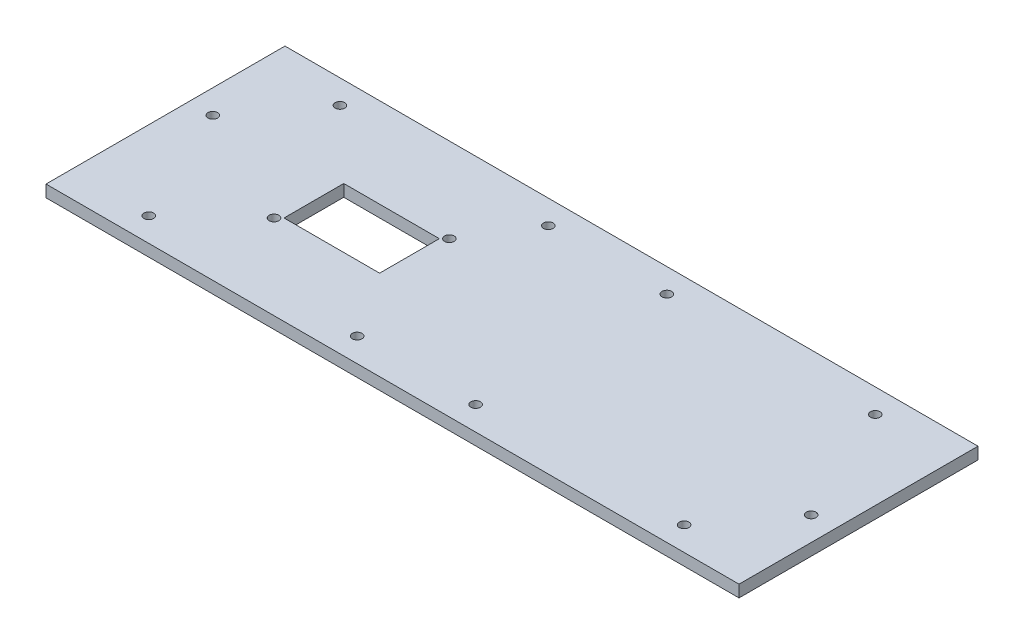
ISO-10303-21;
HEADER;
FILE_DESCRIPTION(('STEP AP214'),'2;1');
FILE_NAME('part.step','',(''),(''),'','','');
FILE_SCHEMA(('AUTOMOTIVE_DESIGN { 1 0 10303 214 1 1 1 1 }'));
ENDSEC;
DATA;
#1=APPLICATION_CONTEXT('core data for automotive mechanical design processes');
#2=APPLICATION_PROTOCOL_DEFINITION('international standard','automotive_design',2000,#1);
#3=PRODUCT_CONTEXT('',#1,'mechanical');
#4=PRODUCT('Part','Part','',(#3));
#5=PRODUCT_RELATED_PRODUCT_CATEGORY('part','',(#4));
#6=PRODUCT_DEFINITION_FORMATION('','',#4);
#7=PRODUCT_DEFINITION_CONTEXT('part definition',#1,'design');
#8=PRODUCT_DEFINITION('design','',#6,#7);
#9=PRODUCT_DEFINITION_SHAPE('','',#8);
#10=(LENGTH_UNIT() NAMED_UNIT(*) SI_UNIT(.MILLI.,.METRE.));
#11=(NAMED_UNIT(*) PLANE_ANGLE_UNIT() SI_UNIT($,.RADIAN.));
#12=(NAMED_UNIT(*) SI_UNIT($,.STERADIAN.) SOLID_ANGLE_UNIT());
#13=UNCERTAINTY_MEASURE_WITH_UNIT(LENGTH_MEASURE(1.E-05),#10,'distance_accuracy_value','');
#14=(GEOMETRIC_REPRESENTATION_CONTEXT(3) GLOBAL_UNCERTAINTY_ASSIGNED_CONTEXT((#13)) GLOBAL_UNIT_ASSIGNED_CONTEXT((#10,
#11,#12)) REPRESENTATION_CONTEXT('',''));
#15=CARTESIAN_POINT('',(0.,0.,0.));
#16=DIRECTION('',(0.,0.,1.));
#17=DIRECTION('',(1.,0.,0.));
#18=AXIS2_PLACEMENT_3D('',#15,#16,#17);
#19=CARTESIAN_POINT('',(0.,6.35,0.));
#20=DIRECTION('',(0.,-1.,0.));
#21=DIRECTION('',(0.,0.,-1.));
#22=AXIS2_PLACEMENT_3D('',#19,#20,#21);
#23=PLANE('',#22);
#24=DIRECTION('',(1.,0.,0.));
#25=VECTOR('',#24,1.);
#26=CARTESIAN_POINT('',(129.667,6.35,-47.6250000000013));
#27=LINE('',#26,#25);
#28=CARTESIAN_POINT('',(78.867,6.35,-47.6250000000013));
#29=VERTEX_POINT('',#28);
#30=CARTESIAN_POINT('',(129.667,6.35,-47.6250000000013));
#31=VERTEX_POINT('',#30);
#32=EDGE_CURVE('E117',#29,#31,#27,.T.);
#33=ORIENTED_EDGE('',*,*,#32,.F.);
#34=DIRECTION('',(0.,0.,1.));
#35=VECTOR('',#34,1.);
#36=CARTESIAN_POINT('',(78.867,6.35,-79.3750000000013));
#37=LINE('',#36,#35);
#38=CARTESIAN_POINT('',(78.867,6.35,-79.3750000000013));
#39=VERTEX_POINT('',#38);
#40=EDGE_CURVE('E100',#39,#29,#37,.T.);
#41=ORIENTED_EDGE('',*,*,#40,.F.);
#42=DIRECTION('',(-1.,0.,0.));
#43=VECTOR('',#42,1.);
#44=CARTESIAN_POINT('',(129.667,6.35,-79.3750000000013));
#45=LINE('',#44,#43);
#46=CARTESIAN_POINT('',(129.667,6.35,-79.3750000000013));
#47=VERTEX_POINT('',#46);
#48=EDGE_CURVE('E109',#47,#39,#45,.T.);
#49=ORIENTED_EDGE('',*,*,#48,.F.);
#50=DIRECTION('',(0.,0.,-1.));
#51=VECTOR('',#50,1.);
#52=CARTESIAN_POINT('',(129.667,6.35,-79.3750000000013));
#53=LINE('',#52,#51);
#54=EDGE_CURVE('E48',#31,#47,#53,.T.);
#55=ORIENTED_EDGE('',*,*,#54,.F.);
#56=EDGE_LOOP('',(#33,#41,#49,#55));
#57=FACE_BOUND('',#56,.T.);
#58=CARTESIAN_POINT('',(132.334,6.35,-82.0420000000013));
#59=DIRECTION('',(0.,-1.,0.));
#60=DIRECTION('',(0.,0.,-1.));
#61=AXIS2_PLACEMENT_3D('',#58,#59,#60);
#62=CIRCLE('',#61,2.55269999999998);
#63=CARTESIAN_POINT('',(132.334,6.35,-84.5947000000012));
#64=VERTEX_POINT('',#63);
#65=EDGE_CURVE('E136',#64,#64,#62,.F.);
#66=ORIENTED_EDGE('',*,*,#65,.F.);
#67=EDGE_LOOP('',(#66));
#68=FACE_BOUND('',#67,.T.);
#69=CARTESIAN_POINT('',(76.2,6.35,-44.9580000000013));
#70=DIRECTION('',(0.,-1.,0.));
#71=DIRECTION('',(0.,0.,-1.));
#72=AXIS2_PLACEMENT_3D('',#69,#70,#71);
#73=CIRCLE('',#72,2.55270000000001);
#74=CARTESIAN_POINT('',(76.2,6.35,-47.5107000000013));
#75=VERTEX_POINT('',#74);
#76=EDGE_CURVE('E142',#75,#75,#73,.F.);
#77=ORIENTED_EDGE('',*,*,#76,.F.);
#78=EDGE_LOOP('',(#77));
#79=FACE_BOUND('',#78,.T.);
#80=DIRECTION('',(0.,0.,-1.));
#81=VECTOR('',#80,1.);
#82=CARTESIAN_POINT('',(368.3,6.35,-127.000000000001));
#83=LINE('',#82,#81);
#84=CARTESIAN_POINT('',(368.3,6.35,-1.27675647831893E-12));
#85=VERTEX_POINT('',#84);
#86=CARTESIAN_POINT('',(368.3,6.35,-127.000000000001));
#87=VERTEX_POINT('',#86);
#88=EDGE_CURVE('E206',#85,#87,#83,.T.);
#89=ORIENTED_EDGE('',*,*,#88,.T.);
#90=DIRECTION('',(-1.,0.,0.));
#91=VECTOR('',#90,1.);
#92=CARTESIAN_POINT('',(368.3,6.35,-127.000000000001));
#93=LINE('',#92,#91);
#94=CARTESIAN_POINT('',(-4.44089209850054E-13,6.35,-127.000000000001));
#95=VERTEX_POINT('',#94);
#96=EDGE_CURVE('E209',#87,#95,#93,.T.);
#97=ORIENTED_EDGE('',*,*,#96,.T.);
#98=DIRECTION('',(0.,0.,1.));
#99=VECTOR('',#98,1.);
#100=CARTESIAN_POINT('',(-4.44089209850054E-13,6.35,-127.000000000001));
#101=LINE('',#100,#99);
#102=CARTESIAN_POINT('',(4.44089209850063E-13,6.35,1.30451205393456E-12));
#103=VERTEX_POINT('',#102);
#104=EDGE_CURVE('E212',#95,#103,#101,.T.);
#105=ORIENTED_EDGE('',*,*,#104,.T.);
#106=DIRECTION('',(1.,0.,0.));
#107=VECTOR('',#106,1.);
#108=CARTESIAN_POINT('',(368.3,6.35,-1.27675647831893E-12));
#109=LINE('',#108,#107);
#110=EDGE_CURVE('E214',#103,#85,#109,.T.);
#111=ORIENTED_EDGE('',*,*,#110,.T.);
#112=EDGE_LOOP('',(#89,#97,#105,#111));
#113=FACE_BOUND('',#112,.T.);
#114=CARTESIAN_POINT('',(326.39,6.35,-12.700000000001));
#115=DIRECTION('',(0.,1.,0.));
#116=DIRECTION('',(0.,0.,1.));
#117=AXIS2_PLACEMENT_3D('',#114,#115,#116);
#118=CIRCLE('',#117,2.5527);
#119=CARTESIAN_POINT('',(326.39,6.35,-10.147300000001));
#120=VERTEX_POINT('',#119);
#121=EDGE_CURVE('E200',#120,#120,#118,.T.);
#122=ORIENTED_EDGE('',*,*,#121,.F.);
#123=EDGE_LOOP('',(#122));
#124=FACE_BOUND('',#123,.T.);
#125=CARTESIAN_POINT('',(41.9100000000004,6.35,-12.699999999999));
#126=DIRECTION('',(0.,1.,0.));
#127=DIRECTION('',(0.,0.,1.));
#128=AXIS2_PLACEMENT_3D('',#125,#126,#127);
#129=CIRCLE('',#128,2.5527);
#130=CARTESIAN_POINT('',(41.9100000000004,6.35,-10.147299999999));
#131=VERTEX_POINT('',#130);
#132=EDGE_CURVE('E194',#131,#131,#129,.T.);
#133=ORIENTED_EDGE('',*,*,#132,.F.);
#134=EDGE_LOOP('',(#133));
#135=FACE_BOUND('',#134,.T.);
#136=CARTESIAN_POINT('',(215.646,6.35,-12.7000000000002));
#137=DIRECTION('',(0.,1.,0.));
#138=DIRECTION('',(0.,0.,1.));
#139=AXIS2_PLACEMENT_3D('',#136,#137,#138);
#140=CIRCLE('',#139,2.55270000000002);
#141=CARTESIAN_POINT('',(215.646,6.35,-10.1473000000002));
#142=VERTEX_POINT('',#141);
#143=EDGE_CURVE('E188',#142,#142,#140,.T.);
#144=ORIENTED_EDGE('',*,*,#143,.F.);
#145=EDGE_LOOP('',(#144));
#146=FACE_BOUND('',#145,.T.);
#147=CARTESIAN_POINT('',(152.654,6.35,-12.6999999999998));
#148=DIRECTION('',(0.,1.,0.));
#149=DIRECTION('',(0.,0.,1.));
#150=AXIS2_PLACEMENT_3D('',#147,#148,#149);
#151=CIRCLE('',#150,2.55270000000005);
#152=CARTESIAN_POINT('',(152.654,6.35,-10.1472999999997));
#153=VERTEX_POINT('',#152);
#154=EDGE_CURVE('E182',#153,#153,#151,.T.);
#155=ORIENTED_EDGE('',*,*,#154,.F.);
#156=EDGE_LOOP('',(#155));
#157=FACE_BOUND('',#156,.T.);
#158=CARTESIAN_POINT('',(215.646,6.35,-114.300000000001));
#159=DIRECTION('',(0.,1.,0.));
#160=DIRECTION('',(0.,0.,1.));
#161=AXIS2_PLACEMENT_3D('',#158,#159,#160);
#162=CIRCLE('',#161,2.55270000000075);
#163=CARTESIAN_POINT('',(215.646,6.35,-111.747300000001));
#164=VERTEX_POINT('',#163);
#165=EDGE_CURVE('E176',#164,#164,#162,.T.);
#166=ORIENTED_EDGE('',*,*,#165,.F.);
#167=EDGE_LOOP('',(#166));
#168=FACE_BOUND('',#167,.T.);
#169=CARTESIAN_POINT('',(41.9099999999996,6.35,-114.3));
#170=DIRECTION('',(0.,1.,0.));
#171=DIRECTION('',(0.,0.,1.));
#172=AXIS2_PLACEMENT_3D('',#169,#170,#171);
#173=CIRCLE('',#172,2.5527000000003);
#174=CARTESIAN_POINT('',(41.9099999999996,6.35,-111.7473));
#175=VERTEX_POINT('',#174);
#176=EDGE_CURVE('E170',#175,#175,#173,.T.);
#177=ORIENTED_EDGE('',*,*,#176,.F.);
#178=EDGE_LOOP('',(#177));
#179=FACE_BOUND('',#178,.T.);
#180=CARTESIAN_POINT('',(326.39,6.35,-114.300000000002));
#181=DIRECTION('',(0.,1.,0.));
#182=DIRECTION('',(0.,0.,1.));
#183=AXIS2_PLACEMENT_3D('',#180,#181,#182);
#184=CIRCLE('',#183,2.55270000000072);
#185=CARTESIAN_POINT('',(326.39,6.35,-111.747300000002));
#186=VERTEX_POINT('',#185);
#187=EDGE_CURVE('E164',#186,#186,#184,.T.);
#188=ORIENTED_EDGE('',*,*,#187,.F.);
#189=EDGE_LOOP('',(#188));
#190=FACE_BOUND('',#189,.T.);
#191=CARTESIAN_POINT('',(152.654,6.35,-114.300000000001));
#192=DIRECTION('',(0.,1.,0.));
#193=DIRECTION('',(0.,0.,1.));
#194=AXIS2_PLACEMENT_3D('',#191,#192,#193);
#195=CIRCLE('',#194,2.5527000000004);
#196=CARTESIAN_POINT('',(152.654,6.35,-111.747300000001));
#197=VERTEX_POINT('',#196);
#198=EDGE_CURVE('E158',#197,#197,#195,.T.);
#199=ORIENTED_EDGE('',*,*,#198,.F.);
#200=EDGE_LOOP('',(#199));
#201=FACE_BOUND('',#200,.T.);
#202=CARTESIAN_POINT('',(12.7000000000001,6.35,-75.9460000000007));
#203=DIRECTION('',(0.,1.,0.));
#204=DIRECTION('',(0.,0.,1.));
#205=AXIS2_PLACEMENT_3D('',#202,#203,#204);
#206=CIRCLE('',#205,2.55270000000064);
#207=CARTESIAN_POINT('',(12.7000000000001,6.35,-73.3933));
#208=VERTEX_POINT('',#207);
#209=EDGE_CURVE('E152',#208,#208,#206,.T.);
#210=ORIENTED_EDGE('',*,*,#209,.F.);
#211=EDGE_LOOP('',(#210));
#212=FACE_BOUND('',#211,.T.);
#213=CARTESIAN_POINT('',(355.6,6.35,-51.0540000000012));
#214=DIRECTION('',(0.,1.,0.));
#215=DIRECTION('',(0.,0.,1.));
#216=AXIS2_PLACEMENT_3D('',#213,#214,#215);
#217=CIRCLE('',#216,2.55270000000021);
#218=CARTESIAN_POINT('',(355.6,6.35,-48.501300000001));
#219=VERTEX_POINT('',#218);
#220=EDGE_CURVE('E146',#219,#219,#217,.T.);
#221=ORIENTED_EDGE('',*,*,#220,.F.);
#222=EDGE_LOOP('',(#221));
#223=FACE_BOUND('',#222,.T.);
#224=ADVANCED_FACE('F33',(#57,#68,#79,#113,#124,#135,#146,#157,#168,#179,#190,#201,#212,#223),
#23,.F.);
#225=CARTESIAN_POINT('',(0.,0.,0.));
#226=DIRECTION('',(0.,-1.,0.));
#227=DIRECTION('',(0.,0.,-1.));
#228=AXIS2_PLACEMENT_3D('',#225,#226,#227);
#229=PLANE('',#228);
#230=DIRECTION('',(0.,0.,-1.));
#231=VECTOR('',#230,1.);
#232=CARTESIAN_POINT('',(78.867,0.,-79.3750000000013));
#233=LINE('',#232,#231);
#234=CARTESIAN_POINT('',(78.867,0.,-47.6250000000013));
#235=VERTEX_POINT('',#234);
#236=CARTESIAN_POINT('',(78.867,0.,-79.3750000000013));
#237=VERTEX_POINT('',#236);
#238=EDGE_CURVE('E56',#235,#237,#233,.T.);
#239=ORIENTED_EDGE('',*,*,#238,.F.);
#240=DIRECTION('',(-1.,0.,0.));
#241=VECTOR('',#240,1.);
#242=CARTESIAN_POINT('',(129.667,0.,-47.6250000000013));
#243=LINE('',#242,#241);
#244=CARTESIAN_POINT('',(129.667,0.,-47.6250000000013));
#245=VERTEX_POINT('',#244);
#246=EDGE_CURVE('E106',#245,#235,#243,.T.);
#247=ORIENTED_EDGE('',*,*,#246,.F.);
#248=DIRECTION('',(0.,0.,1.));
#249=VECTOR('',#248,1.);
#250=CARTESIAN_POINT('',(129.667,0.,-79.3750000000013));
#251=LINE('',#250,#249);
#252=CARTESIAN_POINT('',(129.667,0.,-79.3750000000013));
#253=VERTEX_POINT('',#252);
#254=EDGE_CURVE('E125',#253,#245,#251,.T.);
#255=ORIENTED_EDGE('',*,*,#254,.F.);
#256=DIRECTION('',(1.,0.,0.));
#257=VECTOR('',#256,1.);
#258=CARTESIAN_POINT('',(129.667,0.,-79.3750000000013));
#259=LINE('',#258,#257);
#260=EDGE_CURVE('E119',#237,#253,#259,.T.);
#261=ORIENTED_EDGE('',*,*,#260,.F.);
#262=EDGE_LOOP('',(#239,#247,#255,#261));
#263=FACE_BOUND('',#262,.T.);
#264=CARTESIAN_POINT('',(132.334,0.,-82.0420000000013));
#265=DIRECTION('',(0.,-1.,0.));
#266=DIRECTION('',(0.,0.,-1.));
#267=AXIS2_PLACEMENT_3D('',#264,#265,#266);
#268=CIRCLE('',#267,2.55269999999998);
#269=CARTESIAN_POINT('',(132.334,0.,-84.5947000000012));
#270=VERTEX_POINT('',#269);
#271=EDGE_CURVE('E112',#270,#270,#268,.T.);
#272=ORIENTED_EDGE('',*,*,#271,.F.);
#273=EDGE_LOOP('',(#272));
#274=FACE_BOUND('',#273,.T.);
#275=CARTESIAN_POINT('',(76.2,0.,-44.9580000000013));
#276=DIRECTION('',(0.,-1.,0.));
#277=DIRECTION('',(0.,0.,-1.));
#278=AXIS2_PLACEMENT_3D('',#275,#276,#277);
#279=CIRCLE('',#278,2.55270000000001);
#280=CARTESIAN_POINT('',(76.2,0.,-47.5107000000013));
#281=VERTEX_POINT('',#280);
#282=EDGE_CURVE('E139',#281,#281,#279,.T.);
#283=ORIENTED_EDGE('',*,*,#282,.F.);
#284=EDGE_LOOP('',(#283));
#285=FACE_BOUND('',#284,.T.);
#286=CARTESIAN_POINT('',(12.7000000000001,0.,-75.9460000000007));
#287=DIRECTION('',(0.,1.,0.));
#288=DIRECTION('',(0.,0.,1.));
#289=AXIS2_PLACEMENT_3D('',#286,#287,#288);
#290=CIRCLE('',#289,2.55270000000064);
#291=CARTESIAN_POINT('',(12.7000000000001,0.,-73.3933));
#292=VERTEX_POINT('',#291);
#293=EDGE_CURVE('E149',#292,#292,#290,.T.);
#294=ORIENTED_EDGE('',*,*,#293,.T.);
#295=EDGE_LOOP('',(#294));
#296=FACE_BOUND('',#295,.T.);
#297=CARTESIAN_POINT('',(326.39,0.,-114.300000000002));
#298=DIRECTION('',(0.,1.,0.));
#299=DIRECTION('',(0.,0.,1.));
#300=AXIS2_PLACEMENT_3D('',#297,#298,#299);
#301=CIRCLE('',#300,2.55270000000072);
#302=CARTESIAN_POINT('',(326.39,0.,-111.747300000002));
#303=VERTEX_POINT('',#302);
#304=EDGE_CURVE('E161',#303,#303,#301,.T.);
#305=ORIENTED_EDGE('',*,*,#304,.T.);
#306=EDGE_LOOP('',(#305));
#307=FACE_BOUND('',#306,.T.);
#308=CARTESIAN_POINT('',(215.646,0.,-114.300000000001));
#309=DIRECTION('',(0.,1.,0.));
#310=DIRECTION('',(0.,0.,1.));
#311=AXIS2_PLACEMENT_3D('',#308,#309,#310);
#312=CIRCLE('',#311,2.55270000000075);
#313=CARTESIAN_POINT('',(215.646,0.,-111.747300000001));
#314=VERTEX_POINT('',#313);
#315=EDGE_CURVE('E173',#314,#314,#312,.T.);
#316=ORIENTED_EDGE('',*,*,#315,.T.);
#317=EDGE_LOOP('',(#316));
#318=FACE_BOUND('',#317,.T.);
#319=CARTESIAN_POINT('',(215.646,0.,-12.7000000000002));
#320=DIRECTION('',(0.,1.,0.));
#321=DIRECTION('',(0.,0.,1.));
#322=AXIS2_PLACEMENT_3D('',#319,#320,#321);
#323=CIRCLE('',#322,2.55270000000002);
#324=CARTESIAN_POINT('',(215.646,0.,-10.1473000000002));
#325=VERTEX_POINT('',#324);
#326=EDGE_CURVE('E185',#325,#325,#323,.T.);
#327=ORIENTED_EDGE('',*,*,#326,.T.);
#328=EDGE_LOOP('',(#327));
#329=FACE_BOUND('',#328,.T.);
#330=CARTESIAN_POINT('',(326.39,0.,-12.700000000001));
#331=DIRECTION('',(0.,1.,0.));
#332=DIRECTION('',(0.,0.,1.));
#333=AXIS2_PLACEMENT_3D('',#330,#331,#332);
#334=CIRCLE('',#333,2.5527);
#335=CARTESIAN_POINT('',(326.39,0.,-10.147300000001));
#336=VERTEX_POINT('',#335);
#337=EDGE_CURVE('E197',#336,#336,#334,.T.);
#338=ORIENTED_EDGE('',*,*,#337,.T.);
#339=EDGE_LOOP('',(#338));
#340=FACE_BOUND('',#339,.T.);
#341=DIRECTION('',(0.,0.,-1.));
#342=VECTOR('',#341,1.);
#343=CARTESIAN_POINT('',(368.3,0.,-127.000000000001));
#344=LINE('',#343,#342);
#345=CARTESIAN_POINT('',(368.3,0.,-1.27675647831893E-12));
#346=VERTEX_POINT('',#345);
#347=CARTESIAN_POINT('',(368.3,0.,-127.000000000001));
#348=VERTEX_POINT('',#347);
#349=EDGE_CURVE('E203',#346,#348,#344,.T.);
#350=ORIENTED_EDGE('',*,*,#349,.F.);
#351=DIRECTION('',(1.,0.,0.));
#352=VECTOR('',#351,1.);
#353=CARTESIAN_POINT('',(368.3,0.,-1.27675647831893E-12));
#354=LINE('',#353,#352);
#355=CARTESIAN_POINT('',(4.44089209850063E-13,0.,1.30451205393456E-12));
#356=VERTEX_POINT('',#355);
#357=EDGE_CURVE('E210',#356,#346,#354,.T.);
#358=ORIENTED_EDGE('',*,*,#357,.F.);
#359=DIRECTION('',(0.,0.,1.));
#360=VECTOR('',#359,1.);
#361=CARTESIAN_POINT('',(-4.44089209850054E-13,0.,-127.000000000001));
#362=LINE('',#361,#360);
#363=CARTESIAN_POINT('',(-4.44089209850054E-13,0.,-127.000000000001));
#364=VERTEX_POINT('',#363);
#365=EDGE_CURVE('E221',#364,#356,#362,.T.);
#366=ORIENTED_EDGE('',*,*,#365,.F.);
#367=DIRECTION('',(-1.,0.,0.));
#368=VECTOR('',#367,1.);
#369=CARTESIAN_POINT('',(368.3,0.,-127.000000000001));
#370=LINE('',#369,#368);
#371=EDGE_CURVE('E219',#348,#364,#370,.T.);
#372=ORIENTED_EDGE('',*,*,#371,.F.);
#373=EDGE_LOOP('',(#350,#358,#366,#372));
#374=FACE_BOUND('',#373,.T.);
#375=CARTESIAN_POINT('',(41.9100000000004,0.,-12.699999999999));
#376=DIRECTION('',(0.,1.,0.));
#377=DIRECTION('',(0.,0.,1.));
#378=AXIS2_PLACEMENT_3D('',#375,#376,#377);
#379=CIRCLE('',#378,2.5527);
#380=CARTESIAN_POINT('',(41.9100000000004,0.,-10.147299999999));
#381=VERTEX_POINT('',#380);
#382=EDGE_CURVE('E191',#381,#381,#379,.T.);
#383=ORIENTED_EDGE('',*,*,#382,.T.);
#384=EDGE_LOOP('',(#383));
#385=FACE_BOUND('',#384,.T.);
#386=CARTESIAN_POINT('',(152.654,0.,-12.6999999999998));
#387=DIRECTION('',(0.,1.,0.));
#388=DIRECTION('',(0.,0.,1.));
#389=AXIS2_PLACEMENT_3D('',#386,#387,#388);
#390=CIRCLE('',#389,2.55270000000005);
#391=CARTESIAN_POINT('',(152.654,0.,-10.1472999999997));
#392=VERTEX_POINT('',#391);
#393=EDGE_CURVE('E179',#392,#392,#390,.T.);
#394=ORIENTED_EDGE('',*,*,#393,.T.);
#395=EDGE_LOOP('',(#394));
#396=FACE_BOUND('',#395,.T.);
#397=CARTESIAN_POINT('',(41.9099999999996,0.,-114.3));
#398=DIRECTION('',(0.,1.,0.));
#399=DIRECTION('',(0.,0.,1.));
#400=AXIS2_PLACEMENT_3D('',#397,#398,#399);
#401=CIRCLE('',#400,2.5527000000003);
#402=CARTESIAN_POINT('',(41.9099999999996,0.,-111.7473));
#403=VERTEX_POINT('',#402);
#404=EDGE_CURVE('E167',#403,#403,#401,.T.);
#405=ORIENTED_EDGE('',*,*,#404,.T.);
#406=EDGE_LOOP('',(#405));
#407=FACE_BOUND('',#406,.T.);
#408=CARTESIAN_POINT('',(152.654,0.,-114.300000000001));
#409=DIRECTION('',(0.,1.,0.));
#410=DIRECTION('',(0.,0.,1.));
#411=AXIS2_PLACEMENT_3D('',#408,#409,#410);
#412=CIRCLE('',#411,2.5527000000004);
#413=CARTESIAN_POINT('',(152.654,0.,-111.747300000001));
#414=VERTEX_POINT('',#413);
#415=EDGE_CURVE('E155',#414,#414,#412,.T.);
#416=ORIENTED_EDGE('',*,*,#415,.T.);
#417=EDGE_LOOP('',(#416));
#418=FACE_BOUND('',#417,.T.);
#419=CARTESIAN_POINT('',(355.6,0.,-51.0540000000012));
#420=DIRECTION('',(0.,1.,0.));
#421=DIRECTION('',(0.,0.,1.));
#422=AXIS2_PLACEMENT_3D('',#419,#420,#421);
#423=CIRCLE('',#422,2.55270000000021);
#424=CARTESIAN_POINT('',(355.6,0.,-48.501300000001));
#425=VERTEX_POINT('',#424);
#426=EDGE_CURVE('E145',#425,#425,#423,.T.);
#427=ORIENTED_EDGE('',*,*,#426,.T.);
#428=EDGE_LOOP('',(#427));
#429=FACE_BOUND('',#428,.T.);
#430=ADVANCED_FACE('F239',(#263,#274,#285,#296,#307,#318,#329,#340,#374,#385,#396,#407,#418,
#429),#229,.T.);
#431=CARTESIAN_POINT('',(368.3,6.35,-127.000000000001));
#432=DIRECTION('',(-1.,0.,0.));
#433=DIRECTION('',(0.,0.,1.));
#434=AXIS2_PLACEMENT_3D('',#431,#432,#433);
#435=PLANE('',#434);
#436=ORIENTED_EDGE('',*,*,#349,.T.);
#437=DIRECTION('',(0.,-1.,0.));
#438=VECTOR('',#437,1.);
#439=CARTESIAN_POINT('',(368.3,6.35,-127.000000000001));
#440=LINE('',#439,#438);
#441=EDGE_CURVE('E11',#87,#348,#440,.T.);
#442=ORIENTED_EDGE('',*,*,#441,.F.);
#443=ORIENTED_EDGE('',*,*,#88,.F.);
#444=DIRECTION('',(0.,-1.,0.));
#445=VECTOR('',#444,1.);
#446=CARTESIAN_POINT('',(368.3,6.35,-1.27675647831893E-12));
#447=LINE('',#446,#445);
#448=EDGE_CURVE('E216',#85,#346,#447,.T.);
#449=ORIENTED_EDGE('',*,*,#448,.T.);
#450=EDGE_LOOP('',(#436,#442,#443,#449));
#451=FACE_BOUND('',#450,.T.);
#452=ADVANCED_FACE('F35',(#451),#435,.F.);
#453=CARTESIAN_POINT('',(368.3,6.35,-127.000000000001));
#454=DIRECTION('',(0.,0.,1.));
#455=DIRECTION('',(1.,0.,0.));
#456=AXIS2_PLACEMENT_3D('',#453,#454,#455);
#457=PLANE('',#456);
#458=ORIENTED_EDGE('',*,*,#371,.T.);
#459=DIRECTION('',(0.,-1.,0.));
#460=VECTOR('',#459,1.);
#461=CARTESIAN_POINT('',(-4.44089209850054E-13,6.35,-127.000000000001));
#462=LINE('',#461,#460);
#463=EDGE_CURVE('E41',#95,#364,#462,.T.);
#464=ORIENTED_EDGE('',*,*,#463,.F.);
#465=ORIENTED_EDGE('',*,*,#96,.F.);
#466=ORIENTED_EDGE('',*,*,#441,.T.);
#467=EDGE_LOOP('',(#458,#464,#465,#466));
#468=FACE_BOUND('',#467,.T.);
#469=ADVANCED_FACE('F250',(#468),#457,.F.);
#470=CARTESIAN_POINT('',(-4.44089209850054E-13,6.35,-127.000000000001));
#471=DIRECTION('',(1.,0.,0.));
#472=DIRECTION('',(0.,0.,-1.));
#473=AXIS2_PLACEMENT_3D('',#470,#471,#472);
#474=PLANE('',#473);
#475=ORIENTED_EDGE('',*,*,#365,.T.);
#476=DIRECTION('',(0.,-1.,0.));
#477=VECTOR('',#476,1.);
#478=CARTESIAN_POINT('',(4.44089209850063E-13,6.35,1.30451205393456E-12));
#479=LINE('',#478,#477);
#480=EDGE_CURVE('E226',#103,#356,#479,.T.);
#481=ORIENTED_EDGE('',*,*,#480,.F.);
#482=ORIENTED_EDGE('',*,*,#104,.F.);
#483=ORIENTED_EDGE('',*,*,#463,.T.);
#484=EDGE_LOOP('',(#475,#481,#482,#483));
#485=FACE_BOUND('',#484,.T.);
#486=ADVANCED_FACE('F233',(#485),#474,.F.);
#487=CARTESIAN_POINT('',(368.3,6.35,-1.27675647831893E-12));
#488=DIRECTION('',(0.,0.,-1.));
#489=DIRECTION('',(-1.,0.,0.));
#490=AXIS2_PLACEMENT_3D('',#487,#488,#489);
#491=PLANE('',#490);
#492=ORIENTED_EDGE('',*,*,#357,.T.);
#493=ORIENTED_EDGE('',*,*,#448,.F.);
#494=ORIENTED_EDGE('',*,*,#110,.F.);
#495=ORIENTED_EDGE('',*,*,#480,.T.);
#496=EDGE_LOOP('',(#492,#493,#494,#495));
#497=FACE_BOUND('',#496,.T.);
#498=ADVANCED_FACE('F243',(#497),#491,.F.);
#499=CARTESIAN_POINT('',(326.39,6.35,-12.700000000001));
#500=DIRECTION('',(0.,-1.,0.));
#501=DIRECTION('',(0.,0.,-1.));
#502=AXIS2_PLACEMENT_3D('',#499,#500,#501);
#503=CYLINDRICAL_SURFACE('',#502,2.5527);
#504=ORIENTED_EDGE('',*,*,#121,.T.);
#505=EDGE_LOOP('',(#504));
#506=FACE_BOUND('',#505,.T.);
#507=ORIENTED_EDGE('',*,*,#337,.F.);
#508=EDGE_LOOP('',(#507));
#509=FACE_BOUND('',#508,.T.);
#510=ADVANCED_FACE('F266',(#506,#509),#503,.F.);
#511=CARTESIAN_POINT('',(41.9100000000004,6.35,-12.699999999999));
#512=DIRECTION('',(0.,-1.,0.));
#513=DIRECTION('',(0.,0.,-1.));
#514=AXIS2_PLACEMENT_3D('',#511,#512,#513);
#515=CYLINDRICAL_SURFACE('',#514,2.5527);
#516=ORIENTED_EDGE('',*,*,#132,.T.);
#517=EDGE_LOOP('',(#516));
#518=FACE_BOUND('',#517,.T.);
#519=ORIENTED_EDGE('',*,*,#382,.F.);
#520=EDGE_LOOP('',(#519));
#521=FACE_BOUND('',#520,.T.);
#522=ADVANCED_FACE('F273',(#518,#521),#515,.F.);
#523=CARTESIAN_POINT('',(215.646,6.35,-12.7000000000002));
#524=DIRECTION('',(0.,-1.,0.));
#525=DIRECTION('',(0.,0.,-1.));
#526=AXIS2_PLACEMENT_3D('',#523,#524,#525);
#527=CYLINDRICAL_SURFACE('',#526,2.55270000000002);
#528=ORIENTED_EDGE('',*,*,#143,.T.);
#529=EDGE_LOOP('',(#528));
#530=FACE_BOUND('',#529,.T.);
#531=ORIENTED_EDGE('',*,*,#326,.F.);
#532=EDGE_LOOP('',(#531));
#533=FACE_BOUND('',#532,.T.);
#534=ADVANCED_FACE('F278',(#530,#533),#527,.F.);
#535=CARTESIAN_POINT('',(152.654,6.35,-12.6999999999998));
#536=DIRECTION('',(0.,-1.,0.));
#537=DIRECTION('',(0.,0.,-1.));
#538=AXIS2_PLACEMENT_3D('',#535,#536,#537);
#539=CYLINDRICAL_SURFACE('',#538,2.55270000000005);
#540=ORIENTED_EDGE('',*,*,#154,.T.);
#541=EDGE_LOOP('',(#540));
#542=FACE_BOUND('',#541,.T.);
#543=ORIENTED_EDGE('',*,*,#393,.F.);
#544=EDGE_LOOP('',(#543));
#545=FACE_BOUND('',#544,.T.);
#546=ADVANCED_FACE('F336',(#542,#545),#539,.F.);
#547=CARTESIAN_POINT('',(215.646,6.35,-114.300000000001));
#548=DIRECTION('',(0.,-1.,0.));
#549=DIRECTION('',(0.,0.,-1.));
#550=AXIS2_PLACEMENT_3D('',#547,#548,#549);
#551=CYLINDRICAL_SURFACE('',#550,2.55270000000075);
#552=ORIENTED_EDGE('',*,*,#165,.T.);
#553=EDGE_LOOP('',(#552));
#554=FACE_BOUND('',#553,.T.);
#555=ORIENTED_EDGE('',*,*,#315,.F.);
#556=EDGE_LOOP('',(#555));
#557=FACE_BOUND('',#556,.T.);
#558=ADVANCED_FACE('F332',(#554,#557),#551,.F.);
#559=CARTESIAN_POINT('',(41.9099999999996,6.35,-114.3));
#560=DIRECTION('',(0.,-1.,0.));
#561=DIRECTION('',(0.,0.,-1.));
#562=AXIS2_PLACEMENT_3D('',#559,#560,#561);
#563=CYLINDRICAL_SURFACE('',#562,2.5527000000003);
#564=ORIENTED_EDGE('',*,*,#176,.T.);
#565=EDGE_LOOP('',(#564));
#566=FACE_BOUND('',#565,.T.);
#567=ORIENTED_EDGE('',*,*,#404,.F.);
#568=EDGE_LOOP('',(#567));
#569=FACE_BOUND('',#568,.T.);
#570=ADVANCED_FACE('F328',(#566,#569),#563,.F.);
#571=CARTESIAN_POINT('',(326.39,6.35,-114.300000000002));
#572=DIRECTION('',(0.,-1.,0.));
#573=DIRECTION('',(0.,0.,-1.));
#574=AXIS2_PLACEMENT_3D('',#571,#572,#573);
#575=CYLINDRICAL_SURFACE('',#574,2.55270000000072);
#576=ORIENTED_EDGE('',*,*,#187,.T.);
#577=EDGE_LOOP('',(#576));
#578=FACE_BOUND('',#577,.T.);
#579=ORIENTED_EDGE('',*,*,#304,.F.);
#580=EDGE_LOOP('',(#579));
#581=FACE_BOUND('',#580,.T.);
#582=ADVANCED_FACE('F324',(#578,#581),#575,.F.);
#583=CARTESIAN_POINT('',(152.654,6.35,-114.300000000001));
#584=DIRECTION('',(0.,-1.,0.));
#585=DIRECTION('',(0.,0.,-1.));
#586=AXIS2_PLACEMENT_3D('',#583,#584,#585);
#587=CYLINDRICAL_SURFACE('',#586,2.5527000000004);
#588=ORIENTED_EDGE('',*,*,#198,.T.);
#589=EDGE_LOOP('',(#588));
#590=FACE_BOUND('',#589,.T.);
#591=ORIENTED_EDGE('',*,*,#415,.F.);
#592=EDGE_LOOP('',(#591));
#593=FACE_BOUND('',#592,.T.);
#594=ADVANCED_FACE('F317',(#590,#593),#587,.F.);
#595=CARTESIAN_POINT('',(12.7000000000001,6.35,-75.9460000000007));
#596=DIRECTION('',(0.,-1.,0.));
#597=DIRECTION('',(0.,0.,-1.));
#598=AXIS2_PLACEMENT_3D('',#595,#596,#597);
#599=CYLINDRICAL_SURFACE('',#598,2.55270000000064);
#600=ORIENTED_EDGE('',*,*,#209,.T.);
#601=EDGE_LOOP('',(#600));
#602=FACE_BOUND('',#601,.T.);
#603=ORIENTED_EDGE('',*,*,#293,.F.);
#604=EDGE_LOOP('',(#603));
#605=FACE_BOUND('',#604,.T.);
#606=ADVANCED_FACE('F307',(#602,#605),#599,.F.);
#607=CARTESIAN_POINT('',(355.6,6.35,-51.0540000000012));
#608=DIRECTION('',(0.,-1.,0.));
#609=DIRECTION('',(0.,0.,-1.));
#610=AXIS2_PLACEMENT_3D('',#607,#608,#609);
#611=CYLINDRICAL_SURFACE('',#610,2.55270000000021);
#612=ORIENTED_EDGE('',*,*,#220,.T.);
#613=EDGE_LOOP('',(#612));
#614=FACE_BOUND('',#613,.T.);
#615=ORIENTED_EDGE('',*,*,#426,.F.);
#616=EDGE_LOOP('',(#615));
#617=FACE_BOUND('',#616,.T.);
#618=ADVANCED_FACE('F303',(#614,#617),#611,.F.);
#619=CARTESIAN_POINT('',(76.2,6.351,-44.9580000000013));
#620=DIRECTION('',(0.,-1.,0.));
#621=DIRECTION('',(0.,0.,-1.));
#622=AXIS2_PLACEMENT_3D('',#619,#620,#621);
#623=CYLINDRICAL_SURFACE('',#622,2.55270000000001);
#624=ORIENTED_EDGE('',*,*,#282,.T.);
#625=EDGE_LOOP('',(#624));
#626=FACE_BOUND('',#625,.T.);
#627=ORIENTED_EDGE('',*,*,#76,.T.);
#628=EDGE_LOOP('',(#627));
#629=FACE_BOUND('',#628,.T.);
#630=ADVANCED_FACE('F306',(#626,#629),#623,.F.);
#631=CARTESIAN_POINT('',(132.334,6.351,-82.0420000000013));
#632=DIRECTION('',(0.,-1.,0.));
#633=DIRECTION('',(0.,0.,-1.));
#634=AXIS2_PLACEMENT_3D('',#631,#632,#633);
#635=CYLINDRICAL_SURFACE('',#634,2.55269999999998);
#636=ORIENTED_EDGE('',*,*,#271,.T.);
#637=EDGE_LOOP('',(#636));
#638=FACE_BOUND('',#637,.T.);
#639=ORIENTED_EDGE('',*,*,#65,.T.);
#640=EDGE_LOOP('',(#639));
#641=FACE_BOUND('',#640,.T.);
#642=ADVANCED_FACE('F314',(#638,#641),#635,.F.);
#643=CARTESIAN_POINT('',(78.867,6.351,-79.3750000000013));
#644=DIRECTION('',(-1.,0.,0.));
#645=DIRECTION('',(0.,0.,1.));
#646=AXIS2_PLACEMENT_3D('',#643,#644,#645);
#647=PLANE('',#646);
#648=ORIENTED_EDGE('',*,*,#40,.T.);
#649=DIRECTION('',(0.,-1.,0.));
#650=VECTOR('',#649,1.);
#651=CARTESIAN_POINT('',(78.867,6.351,-47.6250000000013));
#652=LINE('',#651,#650);
#653=EDGE_CURVE('E113',#29,#235,#652,.T.);
#654=ORIENTED_EDGE('',*,*,#653,.T.);
#655=ORIENTED_EDGE('',*,*,#238,.T.);
#656=DIRECTION('',(0.,-1.,0.));
#657=VECTOR('',#656,1.);
#658=CARTESIAN_POINT('',(78.867,6.351,-79.3750000000013));
#659=LINE('',#658,#657);
#660=EDGE_CURVE('E96',#39,#237,#659,.T.);
#661=ORIENTED_EDGE('',*,*,#660,.F.);
#662=EDGE_LOOP('',(#648,#654,#655,#661));
#663=FACE_BOUND('',#662,.T.);
#664=ADVANCED_FACE('F98',(#663),#647,.F.);
#665=CARTESIAN_POINT('',(129.667,6.351,-47.6250000000013));
#666=DIRECTION('',(0.,0.,1.));
#667=DIRECTION('',(1.,0.,0.));
#668=AXIS2_PLACEMENT_3D('',#665,#666,#667);
#669=PLANE('',#668);
#670=ORIENTED_EDGE('',*,*,#32,.T.);
#671=DIRECTION('',(0.,-1.,0.));
#672=VECTOR('',#671,1.);
#673=CARTESIAN_POINT('',(129.667,6.351,-47.6250000000013));
#674=LINE('',#673,#672);
#675=EDGE_CURVE('E131',#31,#245,#674,.T.);
#676=ORIENTED_EDGE('',*,*,#675,.T.);
#677=ORIENTED_EDGE('',*,*,#246,.T.);
#678=ORIENTED_EDGE('',*,*,#653,.F.);
#679=EDGE_LOOP('',(#670,#676,#677,#678));
#680=FACE_BOUND('',#679,.T.);
#681=ADVANCED_FACE('F400',(#680),#669,.F.);
#682=CARTESIAN_POINT('',(129.667,6.351,-79.3750000000013));
#683=DIRECTION('',(1.,0.,0.));
#684=DIRECTION('',(0.,0.,-1.));
#685=AXIS2_PLACEMENT_3D('',#682,#683,#684);
#686=PLANE('',#685);
#687=ORIENTED_EDGE('',*,*,#54,.T.);
#688=DIRECTION('',(0.,-1.,0.));
#689=VECTOR('',#688,1.);
#690=CARTESIAN_POINT('',(129.667,6.351,-79.3750000000013));
#691=LINE('',#690,#689);
#692=EDGE_CURVE('E105',#47,#253,#691,.T.);
#693=ORIENTED_EDGE('',*,*,#692,.T.);
#694=ORIENTED_EDGE('',*,*,#254,.T.);
#695=ORIENTED_EDGE('',*,*,#675,.F.);
#696=EDGE_LOOP('',(#687,#693,#694,#695));
#697=FACE_BOUND('',#696,.T.);
#698=ADVANCED_FACE('F408',(#697),#686,.F.);
#699=CARTESIAN_POINT('',(129.667,6.351,-79.3750000000013));
#700=DIRECTION('',(0.,0.,-1.));
#701=DIRECTION('',(-1.,0.,0.));
#702=AXIS2_PLACEMENT_3D('',#699,#700,#701);
#703=PLANE('',#702);
#704=ORIENTED_EDGE('',*,*,#48,.T.);
#705=ORIENTED_EDGE('',*,*,#660,.T.);
#706=ORIENTED_EDGE('',*,*,#260,.T.);
#707=ORIENTED_EDGE('',*,*,#692,.F.);
#708=EDGE_LOOP('',(#704,#705,#706,#707));
#709=FACE_BOUND('',#708,.T.);
#710=ADVANCED_FACE('F110',(#709),#703,.F.);
#711=CLOSED_SHELL('',(#224,#430,#452,#469,#486,#498,#510,#522,#534,#546,#558,#570,#582,#594,
#606,#618,#630,#642,#664,#681,#698,#710));
#712=MANIFOLD_SOLID_BREP('B2',#711);
#713=ADVANCED_BREP_SHAPE_REPRESENTATION('',(#18,#712),#14);
#714=SHAPE_DEFINITION_REPRESENTATION(#9,#713);
ENDSEC;
END-ISO-10303-21;
